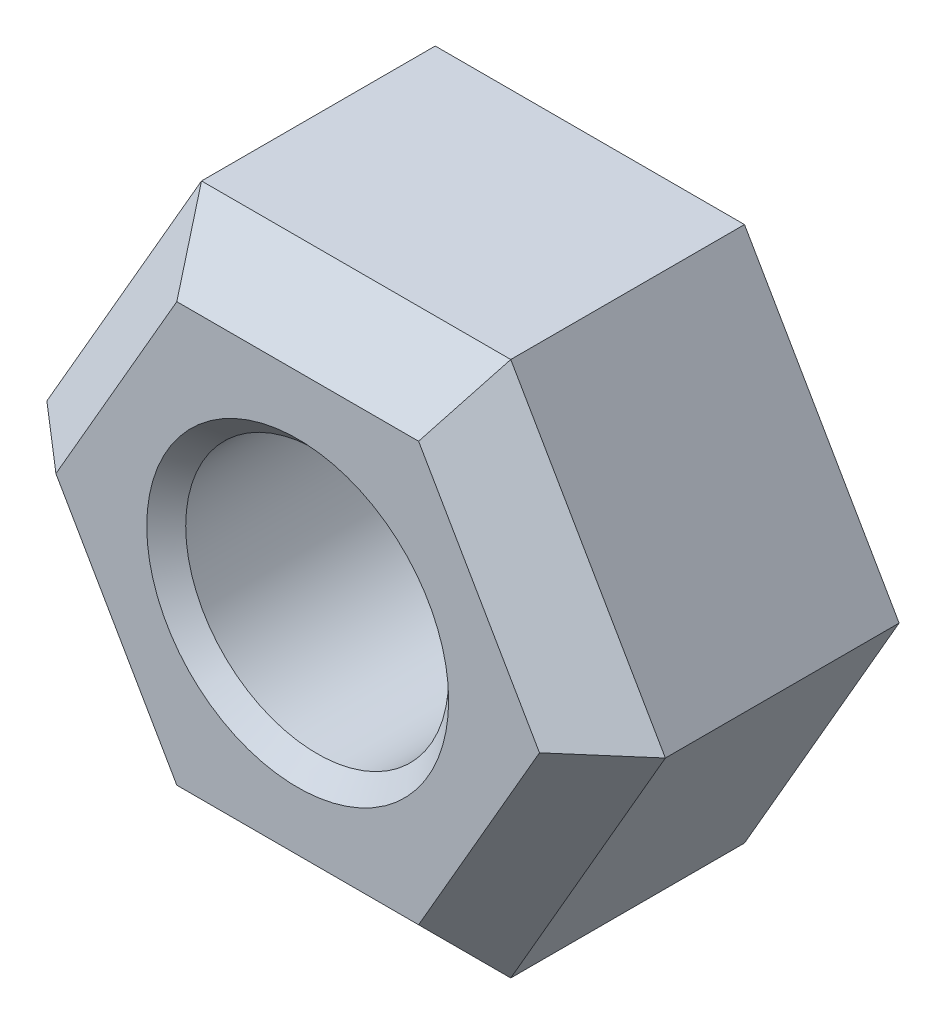
ISO-10303-21;
HEADER;
FILE_DESCRIPTION(('STEP AP214'),'2;1');
FILE_NAME('part.step','',(''),(''),'','','');
FILE_SCHEMA(('AUTOMOTIVE_DESIGN { 1 0 10303 214 1 1 1 1 }'));
ENDSEC;
DATA;
#1=APPLICATION_CONTEXT('core data for automotive mechanical design processes');
#2=APPLICATION_PROTOCOL_DEFINITION('international standard','automotive_design',2000,#1);
#3=PRODUCT_CONTEXT('',#1,'mechanical');
#4=PRODUCT('Part','Part','',(#3));
#5=PRODUCT_RELATED_PRODUCT_CATEGORY('part','',(#4));
#6=PRODUCT_DEFINITION_FORMATION('','',#4);
#7=PRODUCT_DEFINITION_CONTEXT('part definition',#1,'design');
#8=PRODUCT_DEFINITION('design','',#6,#7);
#9=PRODUCT_DEFINITION_SHAPE('','',#8);
#10=(LENGTH_UNIT() NAMED_UNIT(*) SI_UNIT(.MILLI.,.METRE.));
#11=(NAMED_UNIT(*) PLANE_ANGLE_UNIT() SI_UNIT($,.RADIAN.));
#12=(NAMED_UNIT(*) SI_UNIT($,.STERADIAN.) SOLID_ANGLE_UNIT());
#13=UNCERTAINTY_MEASURE_WITH_UNIT(LENGTH_MEASURE(1.E-05),#10,'distance_accuracy_value','');
#14=(GEOMETRIC_REPRESENTATION_CONTEXT(3) GLOBAL_UNCERTAINTY_ASSIGNED_CONTEXT((#13)) GLOBAL_UNIT_ASSIGNED_CONTEXT((#10,
#11,#12)) REPRESENTATION_CONTEXT('',''));
#15=CARTESIAN_POINT('',(0.,0.,0.));
#16=DIRECTION('',(0.,0.,1.));
#17=DIRECTION('',(1.,0.,0.));
#18=AXIS2_PLACEMENT_3D('',#15,#16,#17);
#19=CARTESIAN_POINT('',(0.,0.,3.));
#20=DIRECTION('',(0.,0.,1.));
#21=DIRECTION('',(1.,0.,0.));
#22=AXIS2_PLACEMENT_3D('',#19,#20,#21);
#23=PLANE('',#22);
#24=CARTESIAN_POINT('',(0.,0.,3.));
#25=DIRECTION('',(0.,0.,1.));
#26=DIRECTION('',(1.,0.,0.));
#27=AXIS2_PLACEMENT_3D('',#24,#25,#26);
#28=CIRCLE('',#27,1.55);
#29=CARTESIAN_POINT('',(1.55,0.,3.));
#30=VERTEX_POINT('',#29);
#31=EDGE_CURVE('E11',#30,#30,#28,.F.);
#32=ORIENTED_EDGE('',*,*,#31,.T.);
#33=EDGE_LOOP('',(#32));
#34=FACE_BOUND('',#33,.T.);
#35=DIRECTION('',(-0.5,-0.866025403784439,0.));
#36=VECTOR('',#35,1.);
#37=CARTESIAN_POINT('',(-2.65581123827228,-0.3,3.));
#38=LINE('',#37,#36);
#39=CARTESIAN_POINT('',(-1.24130307875769,2.15,3.));
#40=VERTEX_POINT('',#39);
#41=CARTESIAN_POINT('',(-2.48260615751539,0.,3.));
#42=VERTEX_POINT('',#41);
#43=EDGE_CURVE('E158',#40,#42,#38,.T.);
#44=ORIENTED_EDGE('',*,*,#43,.T.);
#45=DIRECTION('',(0.5,-0.866025403784439,0.));
#46=VECTOR('',#45,1.);
#47=CARTESIAN_POINT('',(-1.06809799800081,-2.45,3.));
#48=LINE('',#47,#46);
#49=CARTESIAN_POINT('',(-1.24130307875769,-2.15,3.));
#50=VERTEX_POINT('',#49);
#51=EDGE_CURVE('E162',#42,#50,#48,.T.);
#52=ORIENTED_EDGE('',*,*,#51,.T.);
#53=DIRECTION('',(1.,0.,0.));
#54=VECTOR('',#53,1.);
#55=CARTESIAN_POINT('',(1.58771324027147,-2.15,3.));
#56=LINE('',#55,#54);
#57=CARTESIAN_POINT('',(1.2413030787577,-2.15,3.));
#58=VERTEX_POINT('',#57);
#59=EDGE_CURVE('E160',#50,#58,#56,.T.);
#60=ORIENTED_EDGE('',*,*,#59,.T.);
#61=DIRECTION('',(0.5,0.866025403784439,0.));
#62=VECTOR('',#61,1.);
#63=CARTESIAN_POINT('',(2.65581123827228,0.3,3.));
#64=LINE('',#63,#62);
#65=CARTESIAN_POINT('',(2.48260615751539,0.,3.));
#66=VERTEX_POINT('',#65);
#67=EDGE_CURVE('E114',#58,#66,#64,.T.);
#68=ORIENTED_EDGE('',*,*,#67,.T.);
#69=DIRECTION('',(-0.5,0.866025403784439,0.));
#70=VECTOR('',#69,1.);
#71=CARTESIAN_POINT('',(1.06809799800081,2.45,3.));
#72=LINE('',#71,#70);
#73=CARTESIAN_POINT('',(1.24130307875769,2.15,3.));
#74=VERTEX_POINT('',#73);
#75=EDGE_CURVE('E154',#66,#74,#72,.T.);
#76=ORIENTED_EDGE('',*,*,#75,.T.);
#77=DIRECTION('',(-1.,0.,0.));
#78=VECTOR('',#77,1.);
#79=CARTESIAN_POINT('',(-1.58771324027147,2.15,3.));
#80=LINE('',#79,#78);
#81=EDGE_CURVE('E156',#74,#40,#80,.T.);
#82=ORIENTED_EDGE('',*,*,#81,.T.);
#83=EDGE_LOOP('',(#44,#52,#60,#68,#76,#82));
#84=FACE_BOUND('',#83,.T.);
#85=ADVANCED_FACE('F35',(#34,#84),#23,.T.);
#86=CARTESIAN_POINT('',(0.,0.,0.));
#87=DIRECTION('',(0.,0.,1.));
#88=DIRECTION('',(1.,0.,0.));
#89=AXIS2_PLACEMENT_3D('',#86,#87,#88);
#90=PLANE('',#89);
#91=CARTESIAN_POINT('',(0.,0.,0.));
#92=DIRECTION('',(0.,0.,1.));
#93=DIRECTION('',(1.,0.,0.));
#94=AXIS2_PLACEMENT_3D('',#91,#92,#93);
#95=CIRCLE('',#94,1.55);
#96=CARTESIAN_POINT('',(1.55,0.,0.));
#97=VERTEX_POINT('',#96);
#98=EDGE_CURVE('E176',#97,#97,#95,.T.);
#99=ORIENTED_EDGE('',*,*,#98,.T.);
#100=EDGE_LOOP('',(#99));
#101=FACE_BOUND('',#100,.T.);
#102=DIRECTION('',(0.5,0.866025403784439,0.));
#103=VECTOR('',#102,1.);
#104=CARTESIAN_POINT('',(1.58771324027147,-2.75,0.));
#105=LINE('',#104,#103);
#106=CARTESIAN_POINT('',(1.58771324027147,-2.75,0.));
#107=VERTEX_POINT('',#106);
#108=CARTESIAN_POINT('',(3.17542648054294,0.,0.));
#109=VERTEX_POINT('',#108);
#110=EDGE_CURVE('E121',#107,#109,#105,.T.);
#111=ORIENTED_EDGE('',*,*,#110,.F.);
#112=DIRECTION('',(1.,0.,0.));
#113=VECTOR('',#112,1.);
#114=CARTESIAN_POINT('',(-1.58771324027147,-2.75,0.));
#115=LINE('',#114,#113);
#116=CARTESIAN_POINT('',(-1.58771324027147,-2.75,0.));
#117=VERTEX_POINT('',#116);
#118=EDGE_CURVE('E143',#117,#107,#115,.T.);
#119=ORIENTED_EDGE('',*,*,#118,.F.);
#120=DIRECTION('',(0.5,-0.866025403784438,0.));
#121=VECTOR('',#120,1.);
#122=CARTESIAN_POINT('',(-3.17542648054294,0.,0.));
#123=LINE('',#122,#121);
#124=CARTESIAN_POINT('',(-3.17542648054294,0.,0.));
#125=VERTEX_POINT('',#124);
#126=EDGE_CURVE('E140',#125,#117,#123,.T.);
#127=ORIENTED_EDGE('',*,*,#126,.F.);
#128=DIRECTION('',(-0.5,-0.866025403784438,0.));
#129=VECTOR('',#128,1.);
#130=CARTESIAN_POINT('',(-1.58771324027147,2.75,0.));
#131=LINE('',#130,#129);
#132=CARTESIAN_POINT('',(-1.58771324027147,2.75,0.));
#133=VERTEX_POINT('',#132);
#134=EDGE_CURVE('E137',#133,#125,#131,.T.);
#135=ORIENTED_EDGE('',*,*,#134,.F.);
#136=DIRECTION('',(-1.,0.,0.));
#137=VECTOR('',#136,1.);
#138=CARTESIAN_POINT('',(1.58771324027147,2.75,0.));
#139=LINE('',#138,#137);
#140=CARTESIAN_POINT('',(1.58771324027147,2.75,0.));
#141=VERTEX_POINT('',#140);
#142=EDGE_CURVE('E124',#141,#133,#139,.T.);
#143=ORIENTED_EDGE('',*,*,#142,.F.);
#144=DIRECTION('',(-0.5,0.866025403784438,0.));
#145=VECTOR('',#144,1.);
#146=CARTESIAN_POINT('',(3.17542648054294,0.,0.));
#147=LINE('',#146,#145);
#148=EDGE_CURVE('E109',#109,#141,#147,.T.);
#149=ORIENTED_EDGE('',*,*,#148,.F.);
#150=EDGE_LOOP('',(#111,#119,#127,#135,#143,#149));
#151=FACE_BOUND('',#150,.T.);
#152=ADVANCED_FACE('F119',(#101,#151),#90,.F.);
#153=CARTESIAN_POINT('',(1.58771324027147,-2.75,3.));
#154=DIRECTION('',(-0.866025403784439,0.5,0.));
#155=DIRECTION('',(-0.5,-0.866025403784439,0.));
#156=AXIS2_PLACEMENT_3D('',#153,#154,#155);
#157=PLANE('',#156);
#158=DIRECTION('',(0.,0.,-1.));
#159=VECTOR('',#158,1.);
#160=CARTESIAN_POINT('',(3.17542648054294,0.,3.));
#161=LINE('',#160,#159);
#162=CARTESIAN_POINT('',(3.17542648054294,0.,2.4));
#163=VERTEX_POINT('',#162);
#164=EDGE_CURVE('E106',#163,#109,#161,.T.);
#165=ORIENTED_EDGE('',*,*,#164,.F.);
#166=DIRECTION('',(-0.5,-0.866025403784439,0.));
#167=VECTOR('',#166,1.);
#168=CARTESIAN_POINT('',(1.58771324027147,-2.75,2.4));
#169=LINE('',#168,#167);
#170=CARTESIAN_POINT('',(1.58771324027147,-2.75,2.4));
#171=VERTEX_POINT('',#170);
#172=EDGE_CURVE('E174',#163,#171,#169,.T.);
#173=ORIENTED_EDGE('',*,*,#172,.T.);
#174=DIRECTION('',(0.,0.,-1.));
#175=VECTOR('',#174,1.);
#176=CARTESIAN_POINT('',(1.58771324027147,-2.75,3.));
#177=LINE('',#176,#175);
#178=EDGE_CURVE('E128',#171,#107,#177,.T.);
#179=ORIENTED_EDGE('',*,*,#178,.T.);
#180=ORIENTED_EDGE('',*,*,#110,.T.);
#181=EDGE_LOOP('',(#165,#173,#179,#180));
#182=FACE_BOUND('',#181,.T.);
#183=ADVANCED_FACE('F126',(#182),#157,.F.);
#184=CARTESIAN_POINT('',(3.17542648054294,0.,3.));
#185=DIRECTION('',(-0.866025403784439,-0.5,0.));
#186=DIRECTION('',(0.5,-0.866025403784439,0.));
#187=AXIS2_PLACEMENT_3D('',#184,#185,#186);
#188=PLANE('',#187);
#189=DIRECTION('',(0.,0.,-1.));
#190=VECTOR('',#189,1.);
#191=CARTESIAN_POINT('',(1.58771324027147,2.75,3.));
#192=LINE('',#191,#190);
#193=CARTESIAN_POINT('',(1.58771324027147,2.75,2.4));
#194=VERTEX_POINT('',#193);
#195=EDGE_CURVE('E115',#194,#141,#192,.T.);
#196=ORIENTED_EDGE('',*,*,#195,.F.);
#197=DIRECTION('',(0.5,-0.866025403784439,0.));
#198=VECTOR('',#197,1.);
#199=CARTESIAN_POINT('',(3.17542648054294,0.,2.4));
#200=LINE('',#199,#198);
#201=EDGE_CURVE('E51',#194,#163,#200,.T.);
#202=ORIENTED_EDGE('',*,*,#201,.T.);
#203=ORIENTED_EDGE('',*,*,#164,.T.);
#204=ORIENTED_EDGE('',*,*,#148,.T.);
#205=EDGE_LOOP('',(#196,#202,#203,#204));
#206=FACE_BOUND('',#205,.T.);
#207=ADVANCED_FACE('F108',(#206),#188,.F.);
#208=CARTESIAN_POINT('',(1.58771324027147,2.75,3.));
#209=DIRECTION('',(0.,-1.,0.));
#210=DIRECTION('',(1.,0.,0.));
#211=AXIS2_PLACEMENT_3D('',#208,#209,#210);
#212=PLANE('',#211);
#213=DIRECTION('',(0.,0.,-1.));
#214=VECTOR('',#213,1.);
#215=CARTESIAN_POINT('',(-1.58771324027147,2.75,3.));
#216=LINE('',#215,#214);
#217=CARTESIAN_POINT('',(-1.58771324027147,2.75,2.4));
#218=VERTEX_POINT('',#217);
#219=EDGE_CURVE('E150',#218,#133,#216,.T.);
#220=ORIENTED_EDGE('',*,*,#219,.F.);
#221=DIRECTION('',(1.,0.,0.));
#222=VECTOR('',#221,1.);
#223=CARTESIAN_POINT('',(1.58771324027147,2.75,2.4));
#224=LINE('',#223,#222);
#225=EDGE_CURVE('E59',#218,#194,#224,.T.);
#226=ORIENTED_EDGE('',*,*,#225,.T.);
#227=ORIENTED_EDGE('',*,*,#195,.T.);
#228=ORIENTED_EDGE('',*,*,#142,.T.);
#229=EDGE_LOOP('',(#220,#226,#227,#228));
#230=FACE_BOUND('',#229,.T.);
#231=ADVANCED_FACE('F227',(#230),#212,.F.);
#232=CARTESIAN_POINT('',(-1.58771324027147,2.75,3.));
#233=DIRECTION('',(0.866025403784439,-0.5,0.));
#234=DIRECTION('',(0.5,0.866025403784439,0.));
#235=AXIS2_PLACEMENT_3D('',#232,#233,#234);
#236=PLANE('',#235);
#237=DIRECTION('',(0.,0.,-1.));
#238=VECTOR('',#237,1.);
#239=CARTESIAN_POINT('',(-3.17542648054294,0.,3.));
#240=LINE('',#239,#238);
#241=CARTESIAN_POINT('',(-3.17542648054294,0.,2.4));
#242=VERTEX_POINT('',#241);
#243=EDGE_CURVE('E148',#242,#125,#240,.T.);
#244=ORIENTED_EDGE('',*,*,#243,.F.);
#245=DIRECTION('',(0.5,0.866025403784439,0.));
#246=VECTOR('',#245,1.);
#247=CARTESIAN_POINT('',(-1.58771324027147,2.75,2.4));
#248=LINE('',#247,#246);
#249=EDGE_CURVE('E170',#242,#218,#248,.T.);
#250=ORIENTED_EDGE('',*,*,#249,.T.);
#251=ORIENTED_EDGE('',*,*,#219,.T.);
#252=ORIENTED_EDGE('',*,*,#134,.T.);
#253=EDGE_LOOP('',(#244,#250,#251,#252));
#254=FACE_BOUND('',#253,.T.);
#255=ADVANCED_FACE('F223',(#254),#236,.F.);
#256=CARTESIAN_POINT('',(-3.17542648054294,0.,3.));
#257=DIRECTION('',(0.866025403784438,0.5,0.));
#258=DIRECTION('',(-0.5,0.866025403784439,0.));
#259=AXIS2_PLACEMENT_3D('',#256,#257,#258);
#260=PLANE('',#259);
#261=DIRECTION('',(0.,0.,-1.));
#262=VECTOR('',#261,1.);
#263=CARTESIAN_POINT('',(-1.58771324027147,-2.75,3.));
#264=LINE('',#263,#262);
#265=CARTESIAN_POINT('',(-1.58771324027147,-2.75,2.4));
#266=VERTEX_POINT('',#265);
#267=EDGE_CURVE('E146',#266,#117,#264,.T.);
#268=ORIENTED_EDGE('',*,*,#267,.F.);
#269=DIRECTION('',(-0.5,0.866025403784439,0.));
#270=VECTOR('',#269,1.);
#271=CARTESIAN_POINT('',(-3.17542648054294,0.,2.4));
#272=LINE('',#271,#270);
#273=EDGE_CURVE('E165',#266,#242,#272,.T.);
#274=ORIENTED_EDGE('',*,*,#273,.T.);
#275=ORIENTED_EDGE('',*,*,#243,.T.);
#276=ORIENTED_EDGE('',*,*,#126,.T.);
#277=EDGE_LOOP('',(#268,#274,#275,#276));
#278=FACE_BOUND('',#277,.T.);
#279=ADVANCED_FACE('F219',(#278),#260,.F.);
#280=CARTESIAN_POINT('',(-1.58771324027147,-2.75,3.));
#281=DIRECTION('',(0.,1.,0.));
#282=DIRECTION('',(0.,0.,1.));
#283=AXIS2_PLACEMENT_3D('',#280,#281,#282);
#284=PLANE('',#283);
#285=ORIENTED_EDGE('',*,*,#178,.F.);
#286=DIRECTION('',(-1.,0.,0.));
#287=VECTOR('',#286,1.);
#288=CARTESIAN_POINT('',(-1.58771324027147,-2.75,2.4));
#289=LINE('',#288,#287);
#290=EDGE_CURVE('E168',#171,#266,#289,.T.);
#291=ORIENTED_EDGE('',*,*,#290,.T.);
#292=ORIENTED_EDGE('',*,*,#267,.T.);
#293=ORIENTED_EDGE('',*,*,#118,.T.);
#294=EDGE_LOOP('',(#285,#291,#292,#293));
#295=FACE_BOUND('',#294,.T.);
#296=ADVANCED_FACE('F216',(#295),#284,.F.);
#297=CARTESIAN_POINT('',(0.,0.,3.));
#298=DIRECTION('',(0.,0.,-1.));
#299=DIRECTION('',(-1.,0.,0.));
#300=AXIS2_PLACEMENT_3D('',#297,#298,#299);
#301=CYLINDRICAL_SURFACE('',#300,1.35);
#302=CARTESIAN_POINT('',(0.,0.,0.200000000000001));
#303=DIRECTION('',(0.,0.,1.));
#304=DIRECTION('',(1.,0.,0.));
#305=AXIS2_PLACEMENT_3D('',#302,#303,#304);
#306=CIRCLE('',#305,1.35);
#307=CARTESIAN_POINT('',(1.35,0.,0.200000000000001));
#308=VERTEX_POINT('',#307);
#309=EDGE_CURVE('E44',#308,#308,#306,.F.);
#310=ORIENTED_EDGE('',*,*,#309,.T.);
#311=EDGE_LOOP('',(#310));
#312=FACE_BOUND('',#311,.T.);
#313=CARTESIAN_POINT('',(0.,0.,2.8));
#314=DIRECTION('',(0.,0.,1.));
#315=DIRECTION('',(1.,0.,0.));
#316=AXIS2_PLACEMENT_3D('',#313,#314,#315);
#317=CIRCLE('',#316,1.35);
#318=CARTESIAN_POINT('',(1.35,0.,2.8));
#319=VERTEX_POINT('',#318);
#320=EDGE_CURVE('E191',#319,#319,#317,.T.);
#321=ORIENTED_EDGE('',*,*,#320,.T.);
#322=EDGE_LOOP('',(#321));
#323=FACE_BOUND('',#322,.T.);
#324=ADVANCED_FACE('F196',(#312,#323),#301,.F.);
#325=CARTESIAN_POINT('',(1.86195461813654,1.075,3.));
#326=DIRECTION('',(0.612372435695796,0.353553390593275,0.707106781186546));
#327=DIRECTION('',(0.5,-0.866025403784439,0.));
#328=AXIS2_PLACEMENT_3D('',#325,#326,#327);
#329=PLANE('',#328);
#330=DIRECTION('',(-0.755928946018453,0.,0.654653670707979));
#331=VECTOR('',#330,1.);
#332=CARTESIAN_POINT('',(2.12794813501319,0.,3.30714285714286));
#333=LINE('',#332,#331);
#334=EDGE_CURVE('E133',#163,#66,#333,.T.);
#335=ORIENTED_EDGE('',*,*,#334,.F.);
#336=ORIENTED_EDGE('',*,*,#201,.F.);
#337=DIRECTION('',(-0.377964473009227,-0.654653670707976,0.654653670707979));
#338=VECTOR('',#337,1.);
#339=CARTESIAN_POINT('',(1.0639740675066,1.84285714285715,3.30714285714286));
#340=LINE('',#339,#338);
#341=EDGE_CURVE('E130',#74,#194,#340,.F.);
#342=ORIENTED_EDGE('',*,*,#341,.F.);
#343=ORIENTED_EDGE('',*,*,#75,.F.);
#344=EDGE_LOOP('',(#335,#336,#342,#343));
#345=FACE_BOUND('',#344,.T.);
#346=ADVANCED_FACE('F268',(#345),#329,.T.);
#347=CARTESIAN_POINT('',(0.,2.15,3.));
#348=DIRECTION('',(0.,0.707106781186549,0.707106781186546));
#349=DIRECTION('',(1.,0.,0.));
#350=AXIS2_PLACEMENT_3D('',#347,#348,#349);
#351=PLANE('',#350);
#352=ORIENTED_EDGE('',*,*,#341,.T.);
#353=ORIENTED_EDGE('',*,*,#225,.F.);
#354=DIRECTION('',(0.377964473009227,-0.654653670707975,0.654653670707979));
#355=VECTOR('',#354,1.);
#356=CARTESIAN_POINT('',(-1.0639740675066,1.84285714285714,3.30714285714286));
#357=LINE('',#356,#355);
#358=EDGE_CURVE('E184',#40,#218,#357,.F.);
#359=ORIENTED_EDGE('',*,*,#358,.F.);
#360=ORIENTED_EDGE('',*,*,#81,.F.);
#361=EDGE_LOOP('',(#352,#353,#359,#360));
#362=FACE_BOUND('',#361,.T.);
#363=ADVANCED_FACE('F261',(#362),#351,.T.);
#364=CARTESIAN_POINT('',(1.86195461813654,-1.075,3.));
#365=DIRECTION('',(0.612372435695796,-0.353553390593274,0.707106781186546));
#366=DIRECTION('',(-0.5,-0.866025403784439,0.));
#367=AXIS2_PLACEMENT_3D('',#364,#365,#366);
#368=PLANE('',#367);
#369=ORIENTED_EDGE('',*,*,#334,.T.);
#370=ORIENTED_EDGE('',*,*,#67,.F.);
#371=DIRECTION('',(0.377964473009227,-0.654653670707976,-0.654653670707979));
#372=VECTOR('',#371,1.);
#373=CARTESIAN_POINT('',(1.0639740675066,-1.84285714285714,3.30714285714286));
#374=LINE('',#373,#372);
#375=EDGE_CURVE('E181',#171,#58,#374,.F.);
#376=ORIENTED_EDGE('',*,*,#375,.F.);
#377=ORIENTED_EDGE('',*,*,#172,.F.);
#378=EDGE_LOOP('',(#369,#370,#376,#377));
#379=FACE_BOUND('',#378,.T.);
#380=ADVANCED_FACE('F254',(#379),#368,.T.);
#381=CARTESIAN_POINT('',(-1.86195461813654,1.075,3.));
#382=DIRECTION('',(-0.612372435695796,0.353553390593274,0.707106781186546));
#383=DIRECTION('',(0.5,0.866025403784439,0.));
#384=AXIS2_PLACEMENT_3D('',#381,#382,#383);
#385=PLANE('',#384);
#386=ORIENTED_EDGE('',*,*,#358,.T.);
#387=ORIENTED_EDGE('',*,*,#249,.F.);
#388=DIRECTION('',(0.755928946018453,0.,0.654653670707979));
#389=VECTOR('',#388,1.);
#390=CARTESIAN_POINT('',(-2.12794813501319,0.,3.30714285714286));
#391=LINE('',#390,#389);
#392=EDGE_CURVE('E179',#42,#242,#391,.F.);
#393=ORIENTED_EDGE('',*,*,#392,.F.);
#394=ORIENTED_EDGE('',*,*,#43,.F.);
#395=EDGE_LOOP('',(#386,#387,#393,#394));
#396=FACE_BOUND('',#395,.T.);
#397=ADVANCED_FACE('F247',(#396),#385,.T.);
#398=CARTESIAN_POINT('',(0.,-2.15,3.));
#399=DIRECTION('',(0.,-0.707106781186549,0.707106781186546));
#400=DIRECTION('',(-1.,0.,0.));
#401=AXIS2_PLACEMENT_3D('',#398,#399,#400);
#402=PLANE('',#401);
#403=ORIENTED_EDGE('',*,*,#375,.T.);
#404=ORIENTED_EDGE('',*,*,#59,.F.);
#405=DIRECTION('',(-0.377964473009227,-0.654653670707976,-0.654653670707979));
#406=VECTOR('',#405,1.);
#407=CARTESIAN_POINT('',(-1.0639740675066,-1.84285714285714,3.30714285714286));
#408=LINE('',#407,#406);
#409=EDGE_CURVE('E177',#266,#50,#408,.F.);
#410=ORIENTED_EDGE('',*,*,#409,.F.);
#411=ORIENTED_EDGE('',*,*,#290,.F.);
#412=EDGE_LOOP('',(#403,#404,#410,#411));
#413=FACE_BOUND('',#412,.T.);
#414=ADVANCED_FACE('F240',(#413),#402,.T.);
#415=CARTESIAN_POINT('',(-1.86195461813654,-1.075,3.));
#416=DIRECTION('',(-0.612372435695796,-0.353553390593275,0.707106781186546));
#417=DIRECTION('',(-0.5,0.866025403784439,0.));
#418=AXIS2_PLACEMENT_3D('',#415,#416,#417);
#419=PLANE('',#418);
#420=ORIENTED_EDGE('',*,*,#392,.T.);
#421=ORIENTED_EDGE('',*,*,#273,.F.);
#422=ORIENTED_EDGE('',*,*,#409,.T.);
#423=ORIENTED_EDGE('',*,*,#51,.F.);
#424=EDGE_LOOP('',(#420,#421,#422,#423));
#425=FACE_BOUND('',#424,.T.);
#426=ADVANCED_FACE('F202',(#425),#419,.T.);
#427=CARTESIAN_POINT('',(0.,0.,0.));
#428=DIRECTION('',(0.,0.,-1.));
#429=DIRECTION('',(-1.,0.,0.));
#430=AXIS2_PLACEMENT_3D('',#427,#428,#429);
#431=CONICAL_SURFACE('',#430,1.55,0.785398163397447);
#432=ORIENTED_EDGE('',*,*,#309,.F.);
#433=EDGE_LOOP('',(#432));
#434=FACE_BOUND('',#433,.T.);
#435=ORIENTED_EDGE('',*,*,#98,.F.);
#436=EDGE_LOOP('',(#435));
#437=FACE_BOUND('',#436,.T.);
#438=ADVANCED_FACE('F199',(#434,#437),#431,.F.);
#439=CARTESIAN_POINT('',(0.,0.,2.8));
#440=DIRECTION('',(0.,0.,1.));
#441=DIRECTION('',(1.,0.,0.));
#442=AXIS2_PLACEMENT_3D('',#439,#440,#441);
#443=CONICAL_SURFACE('',#442,1.35,0.785398163397451);
#444=ORIENTED_EDGE('',*,*,#31,.F.);
#445=EDGE_LOOP('',(#444));
#446=FACE_BOUND('',#445,.T.);
#447=ORIENTED_EDGE('',*,*,#320,.F.);
#448=EDGE_LOOP('',(#447));
#449=FACE_BOUND('',#448,.T.);
#450=ADVANCED_FACE('F38',(#446,#449),#443,.F.);
#451=CLOSED_SHELL('',(#85,#152,#183,#207,#231,#255,#279,#296,#324,#346,#363,#380,#397,#414,#426,
#438,#450));
#452=MANIFOLD_SOLID_BREP('B2',#451);
#453=ADVANCED_BREP_SHAPE_REPRESENTATION('',(#18,#452),#14);
#454=SHAPE_DEFINITION_REPRESENTATION(#9,#453);
ENDSEC;
END-ISO-10303-21;
